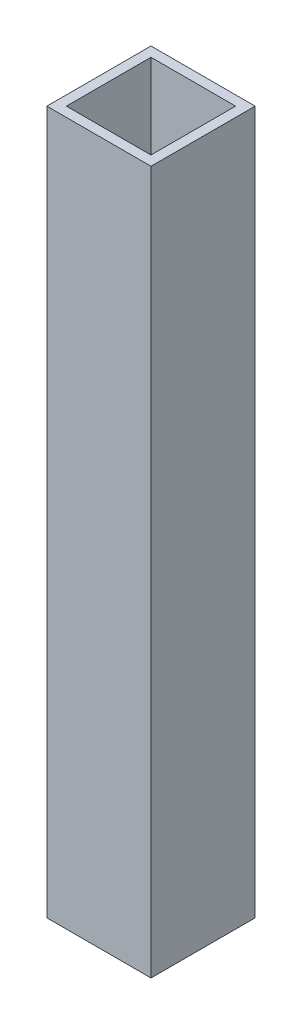
ISO-10303-21;
HEADER;
FILE_DESCRIPTION(('STEP AP214'),'2;1');
FILE_NAME('part.step','',(''),(''),'','','');
FILE_SCHEMA(('AUTOMOTIVE_DESIGN { 1 0 10303 214 1 1 1 1 }'));
ENDSEC;
DATA;
#1=APPLICATION_CONTEXT('core data for automotive mechanical design processes');
#2=APPLICATION_PROTOCOL_DEFINITION('international standard','automotive_design',2000,#1);
#3=PRODUCT_CONTEXT('',#1,'mechanical');
#4=PRODUCT('Part','Part','',(#3));
#5=PRODUCT_RELATED_PRODUCT_CATEGORY('part','',(#4));
#6=PRODUCT_DEFINITION_FORMATION('','',#4);
#7=PRODUCT_DEFINITION_CONTEXT('part definition',#1,'design');
#8=PRODUCT_DEFINITION('design','',#6,#7);
#9=PRODUCT_DEFINITION_SHAPE('','',#8);
#10=(LENGTH_UNIT() NAMED_UNIT(*) SI_UNIT(.MILLI.,.METRE.));
#11=(NAMED_UNIT(*) PLANE_ANGLE_UNIT() SI_UNIT($,.RADIAN.));
#12=(NAMED_UNIT(*) SI_UNIT($,.STERADIAN.) SOLID_ANGLE_UNIT());
#13=UNCERTAINTY_MEASURE_WITH_UNIT(LENGTH_MEASURE(1.E-05),#10,'distance_accuracy_value','');
#14=(GEOMETRIC_REPRESENTATION_CONTEXT(3) GLOBAL_UNCERTAINTY_ASSIGNED_CONTEXT((#13)) GLOBAL_UNIT_ASSIGNED_CONTEXT((#10,
#11,#12)) REPRESENTATION_CONTEXT('',''));
#15=CARTESIAN_POINT('',(0.,0.,0.));
#16=DIRECTION('',(0.,0.,1.));
#17=DIRECTION('',(1.,0.,0.));
#18=AXIS2_PLACEMENT_3D('',#15,#16,#17);
#19=CARTESIAN_POINT('',(25.4,171.45,50.8));
#20=DIRECTION('',(-1.,0.,0.));
#21=DIRECTION('',(0.,-1.,0.));
#22=AXIS2_PLACEMENT_3D('',#19,#20,#21);
#23=PLANE('',#22);
#24=DIRECTION('',(0.,1.,0.));
#25=VECTOR('',#24,1.);
#26=CARTESIAN_POINT('',(25.4,171.45,0.));
#27=LINE('',#26,#25);
#28=CARTESIAN_POINT('',(25.4,-171.45,0.));
#29=VERTEX_POINT('',#28);
#30=CARTESIAN_POINT('',(25.4,171.45,0.));
#31=VERTEX_POINT('',#30);
#32=EDGE_CURVE('E95',#29,#31,#27,.T.);
#33=ORIENTED_EDGE('',*,*,#32,.T.);
#34=DIRECTION('',(0.,0.,-1.));
#35=VECTOR('',#34,1.);
#36=CARTESIAN_POINT('',(25.4,171.45,50.8));
#37=LINE('',#36,#35);
#38=CARTESIAN_POINT('',(25.4,171.45,50.8));
#39=VERTEX_POINT('',#38);
#40=EDGE_CURVE('E11',#39,#31,#37,.T.);
#41=ORIENTED_EDGE('',*,*,#40,.F.);
#42=DIRECTION('',(0.,1.,0.));
#43=VECTOR('',#42,1.);
#44=CARTESIAN_POINT('',(25.4,171.45,50.8));
#45=LINE('',#44,#43);
#46=CARTESIAN_POINT('',(25.4,-171.45,50.8));
#47=VERTEX_POINT('',#46);
#48=EDGE_CURVE('E118',#47,#39,#45,.T.);
#49=ORIENTED_EDGE('',*,*,#48,.F.);
#50=DIRECTION('',(0.,0.,-1.));
#51=VECTOR('',#50,1.);
#52=CARTESIAN_POINT('',(25.4,-171.45,50.8));
#53=LINE('',#52,#51);
#54=EDGE_CURVE('E128',#47,#29,#53,.T.);
#55=ORIENTED_EDGE('',*,*,#54,.T.);
#56=EDGE_LOOP('',(#33,#41,#49,#55));
#57=FACE_BOUND('',#56,.T.);
#58=ADVANCED_FACE('F17',(#57),#23,.F.);
#59=CARTESIAN_POINT('',(-25.4,171.45,50.8));
#60=DIRECTION('',(0.,-1.,0.));
#61=DIRECTION('',(0.,0.,-1.));
#62=AXIS2_PLACEMENT_3D('',#59,#60,#61);
#63=PLANE('',#62);
#64=DIRECTION('',(0.,0.,-1.));
#65=VECTOR('',#64,1.);
#66=CARTESIAN_POINT('',(20.6375,171.45,46.0375));
#67=LINE('',#66,#65);
#68=CARTESIAN_POINT('',(20.6375,171.45,46.0375));
#69=VERTEX_POINT('',#68);
#70=CARTESIAN_POINT('',(20.6375,171.45,4.7625));
#71=VERTEX_POINT('',#70);
#72=EDGE_CURVE('E103',#69,#71,#67,.T.);
#73=ORIENTED_EDGE('',*,*,#72,.F.);
#74=DIRECTION('',(1.,0.,0.));
#75=VECTOR('',#74,1.);
#76=CARTESIAN_POINT('',(-20.6375,171.45,46.0375));
#77=LINE('',#76,#75);
#78=CARTESIAN_POINT('',(-20.6375,171.45,46.0375));
#79=VERTEX_POINT('',#78);
#80=EDGE_CURVE('E31',#79,#69,#77,.T.);
#81=ORIENTED_EDGE('',*,*,#80,.F.);
#82=DIRECTION('',(0.,0.,1.));
#83=VECTOR('',#82,1.);
#84=CARTESIAN_POINT('',(-20.6375,171.45,4.7625));
#85=LINE('',#84,#83);
#86=CARTESIAN_POINT('',(-20.6375,171.45,4.7625));
#87=VERTEX_POINT('',#86);
#88=EDGE_CURVE('E89',#87,#79,#85,.T.);
#89=ORIENTED_EDGE('',*,*,#88,.F.);
#90=DIRECTION('',(-1.,0.,0.));
#91=VECTOR('',#90,1.);
#92=CARTESIAN_POINT('',(20.6375,171.45,4.7625));
#93=LINE('',#92,#91);
#94=EDGE_CURVE('E109',#71,#87,#93,.T.);
#95=ORIENTED_EDGE('',*,*,#94,.F.);
#96=EDGE_LOOP('',(#73,#81,#89,#95));
#97=FACE_BOUND('',#96,.T.);
#98=DIRECTION('',(-1.,0.,0.));
#99=VECTOR('',#98,1.);
#100=CARTESIAN_POINT('',(-25.4,171.45,0.));
#101=LINE('',#100,#99);
#102=CARTESIAN_POINT('',(-25.4,171.45,0.));
#103=VERTEX_POINT('',#102);
#104=EDGE_CURVE('E131',#31,#103,#101,.T.);
#105=ORIENTED_EDGE('',*,*,#104,.T.);
#106=DIRECTION('',(0.,0.,-1.));
#107=VECTOR('',#106,1.);
#108=CARTESIAN_POINT('',(-25.4,171.45,50.8));
#109=LINE('',#108,#107);
#110=CARTESIAN_POINT('',(-25.4,171.45,50.8));
#111=VERTEX_POINT('',#110);
#112=EDGE_CURVE('E24',#111,#103,#109,.T.);
#113=ORIENTED_EDGE('',*,*,#112,.F.);
#114=DIRECTION('',(-1.,0.,0.));
#115=VECTOR('',#114,1.);
#116=CARTESIAN_POINT('',(-25.4,171.45,50.8));
#117=LINE('',#116,#115);
#118=EDGE_CURVE('E121',#39,#111,#117,.T.);
#119=ORIENTED_EDGE('',*,*,#118,.F.);
#120=ORIENTED_EDGE('',*,*,#40,.T.);
#121=EDGE_LOOP('',(#105,#113,#119,#120));
#122=FACE_BOUND('',#121,.T.);
#123=ADVANCED_FACE('F159',(#97,#122),#63,.F.);
#124=CARTESIAN_POINT('',(-25.4,171.45,50.8));
#125=DIRECTION('',(1.,0.,0.));
#126=DIRECTION('',(0.,1.,0.));
#127=AXIS2_PLACEMENT_3D('',#124,#125,#126);
#128=PLANE('',#127);
#129=DIRECTION('',(0.,-1.,0.));
#130=VECTOR('',#129,1.);
#131=CARTESIAN_POINT('',(-25.4,171.45,0.));
#132=LINE('',#131,#130);
#133=CARTESIAN_POINT('',(-25.4,-171.45,0.));
#134=VERTEX_POINT('',#133);
#135=EDGE_CURVE('E133',#103,#134,#132,.T.);
#136=ORIENTED_EDGE('',*,*,#135,.T.);
#137=DIRECTION('',(0.,0.,-1.));
#138=VECTOR('',#137,1.);
#139=CARTESIAN_POINT('',(-25.4,-171.45,50.8));
#140=LINE('',#139,#138);
#141=CARTESIAN_POINT('',(-25.4,-171.45,50.8));
#142=VERTEX_POINT('',#141);
#143=EDGE_CURVE('E138',#142,#134,#140,.T.);
#144=ORIENTED_EDGE('',*,*,#143,.F.);
#145=DIRECTION('',(0.,-1.,0.));
#146=VECTOR('',#145,1.);
#147=CARTESIAN_POINT('',(-25.4,171.45,50.8));
#148=LINE('',#147,#146);
#149=EDGE_CURVE('E124',#111,#142,#148,.T.);
#150=ORIENTED_EDGE('',*,*,#149,.F.);
#151=ORIENTED_EDGE('',*,*,#112,.T.);
#152=EDGE_LOOP('',(#136,#144,#150,#151));
#153=FACE_BOUND('',#152,.T.);
#154=ADVANCED_FACE('F145',(#153),#128,.F.);
#155=CARTESIAN_POINT('',(-25.4,-171.45,50.8));
#156=DIRECTION('',(0.,1.,0.));
#157=DIRECTION('',(0.,0.,1.));
#158=AXIS2_PLACEMENT_3D('',#155,#156,#157);
#159=PLANE('',#158);
#160=DIRECTION('',(0.,0.,-1.));
#161=VECTOR('',#160,1.);
#162=CARTESIAN_POINT('',(-20.6375,-171.45,4.7625));
#163=LINE('',#162,#161);
#164=CARTESIAN_POINT('',(-20.6375,-171.45,46.0375));
#165=VERTEX_POINT('',#164);
#166=CARTESIAN_POINT('',(-20.6375,-171.45,4.7625));
#167=VERTEX_POINT('',#166);
#168=EDGE_CURVE('E101',#165,#167,#163,.T.);
#169=ORIENTED_EDGE('',*,*,#168,.F.);
#170=DIRECTION('',(-1.,0.,0.));
#171=VECTOR('',#170,1.);
#172=CARTESIAN_POINT('',(-20.6375,-171.45,46.0375));
#173=LINE('',#172,#171);
#174=CARTESIAN_POINT('',(20.6375,-171.45,46.0375));
#175=VERTEX_POINT('',#174);
#176=EDGE_CURVE('E83',#175,#165,#173,.T.);
#177=ORIENTED_EDGE('',*,*,#176,.F.);
#178=DIRECTION('',(0.,0.,1.));
#179=VECTOR('',#178,1.);
#180=CARTESIAN_POINT('',(20.6375,-171.45,46.0375));
#181=LINE('',#180,#179);
#182=CARTESIAN_POINT('',(20.6375,-171.45,4.7625));
#183=VERTEX_POINT('',#182);
#184=EDGE_CURVE('E92',#183,#175,#181,.T.);
#185=ORIENTED_EDGE('',*,*,#184,.F.);
#186=DIRECTION('',(1.,0.,0.));
#187=VECTOR('',#186,1.);
#188=CARTESIAN_POINT('',(20.6375,-171.45,4.7625));
#189=LINE('',#188,#187);
#190=EDGE_CURVE('E39',#167,#183,#189,.T.);
#191=ORIENTED_EDGE('',*,*,#190,.F.);
#192=EDGE_LOOP('',(#169,#177,#185,#191));
#193=FACE_BOUND('',#192,.T.);
#194=DIRECTION('',(1.,0.,0.));
#195=VECTOR('',#194,1.);
#196=CARTESIAN_POINT('',(-25.4,-171.45,0.));
#197=LINE('',#196,#195);
#198=EDGE_CURVE('E122',#134,#29,#197,.T.);
#199=ORIENTED_EDGE('',*,*,#198,.T.);
#200=ORIENTED_EDGE('',*,*,#54,.F.);
#201=DIRECTION('',(1.,0.,0.));
#202=VECTOR('',#201,1.);
#203=CARTESIAN_POINT('',(-25.4,-171.45,50.8));
#204=LINE('',#203,#202);
#205=EDGE_CURVE('E126',#142,#47,#204,.T.);
#206=ORIENTED_EDGE('',*,*,#205,.F.);
#207=ORIENTED_EDGE('',*,*,#143,.T.);
#208=EDGE_LOOP('',(#199,#200,#206,#207));
#209=FACE_BOUND('',#208,.T.);
#210=ADVANCED_FACE('F98',(#193,#209),#159,.F.);
#211=CARTESIAN_POINT('',(25.4,-171.45,50.8));
#212=DIRECTION('',(0.,0.,1.));
#213=DIRECTION('',(1.,0.,0.));
#214=AXIS2_PLACEMENT_3D('',#211,#212,#213);
#215=PLANE('',#214);
#216=ORIENTED_EDGE('',*,*,#48,.T.);
#217=ORIENTED_EDGE('',*,*,#118,.T.);
#218=ORIENTED_EDGE('',*,*,#149,.T.);
#219=ORIENTED_EDGE('',*,*,#205,.T.);
#220=EDGE_LOOP('',(#216,#217,#218,#219));
#221=FACE_BOUND('',#220,.T.);
#222=ADVANCED_FACE('F158',(#221),#215,.T.);
#223=CARTESIAN_POINT('',(25.4,-171.45,0.));
#224=DIRECTION('',(0.,0.,1.));
#225=DIRECTION('',(1.,0.,0.));
#226=AXIS2_PLACEMENT_3D('',#223,#224,#225);
#227=PLANE('',#226);
#228=ORIENTED_EDGE('',*,*,#32,.F.);
#229=ORIENTED_EDGE('',*,*,#198,.F.);
#230=ORIENTED_EDGE('',*,*,#135,.F.);
#231=ORIENTED_EDGE('',*,*,#104,.F.);
#232=EDGE_LOOP('',(#228,#229,#230,#231));
#233=FACE_BOUND('',#232,.T.);
#234=ADVANCED_FACE('F151',(#233),#227,.F.);
#235=CARTESIAN_POINT('',(-20.6375,-171.451,46.0375));
#236=DIRECTION('',(0.,0.,1.));
#237=DIRECTION('',(1.,0.,0.));
#238=AXIS2_PLACEMENT_3D('',#235,#236,#237);
#239=PLANE('',#238);
#240=ORIENTED_EDGE('',*,*,#176,.T.);
#241=DIRECTION('',(0.,1.,0.));
#242=VECTOR('',#241,1.);
#243=CARTESIAN_POINT('',(-20.6375,-171.451,46.0375));
#244=LINE('',#243,#242);
#245=EDGE_CURVE('E96',#165,#79,#244,.T.);
#246=ORIENTED_EDGE('',*,*,#245,.T.);
#247=ORIENTED_EDGE('',*,*,#80,.T.);
#248=DIRECTION('',(0.,1.,0.));
#249=VECTOR('',#248,1.);
#250=CARTESIAN_POINT('',(20.6375,-171.451,46.0375));
#251=LINE('',#250,#249);
#252=EDGE_CURVE('E79',#175,#69,#251,.T.);
#253=ORIENTED_EDGE('',*,*,#252,.F.);
#254=EDGE_LOOP('',(#240,#246,#247,#253));
#255=FACE_BOUND('',#254,.T.);
#256=ADVANCED_FACE('F81',(#255),#239,.F.);
#257=CARTESIAN_POINT('',(-20.6375,-171.451,4.7625));
#258=DIRECTION('',(-1.,0.,0.));
#259=DIRECTION('',(0.,0.,1.));
#260=AXIS2_PLACEMENT_3D('',#257,#258,#259);
#261=PLANE('',#260);
#262=ORIENTED_EDGE('',*,*,#168,.T.);
#263=DIRECTION('',(0.,1.,0.));
#264=VECTOR('',#263,1.);
#265=CARTESIAN_POINT('',(-20.6375,-171.451,4.7625));
#266=LINE('',#265,#264);
#267=EDGE_CURVE('E115',#167,#87,#266,.T.);
#268=ORIENTED_EDGE('',*,*,#267,.T.);
#269=ORIENTED_EDGE('',*,*,#88,.T.);
#270=ORIENTED_EDGE('',*,*,#245,.F.);
#271=EDGE_LOOP('',(#262,#268,#269,#270));
#272=FACE_BOUND('',#271,.T.);
#273=ADVANCED_FACE('F178',(#272),#261,.F.);
#274=CARTESIAN_POINT('',(20.6375,-171.451,4.7625));
#275=DIRECTION('',(0.,0.,-1.));
#276=DIRECTION('',(-1.,0.,0.));
#277=AXIS2_PLACEMENT_3D('',#274,#275,#276);
#278=PLANE('',#277);
#279=ORIENTED_EDGE('',*,*,#190,.T.);
#280=DIRECTION('',(0.,1.,0.));
#281=VECTOR('',#280,1.);
#282=CARTESIAN_POINT('',(20.6375,-171.451,4.7625));
#283=LINE('',#282,#281);
#284=EDGE_CURVE('E88',#183,#71,#283,.T.);
#285=ORIENTED_EDGE('',*,*,#284,.T.);
#286=ORIENTED_EDGE('',*,*,#94,.T.);
#287=ORIENTED_EDGE('',*,*,#267,.F.);
#288=EDGE_LOOP('',(#279,#285,#286,#287));
#289=FACE_BOUND('',#288,.T.);
#290=ADVANCED_FACE('F181',(#289),#278,.F.);
#291=CARTESIAN_POINT('',(20.6375,-171.451,46.0375));
#292=DIRECTION('',(1.,0.,0.));
#293=DIRECTION('',(0.,0.,-1.));
#294=AXIS2_PLACEMENT_3D('',#291,#292,#293);
#295=PLANE('',#294);
#296=ORIENTED_EDGE('',*,*,#184,.T.);
#297=ORIENTED_EDGE('',*,*,#252,.T.);
#298=ORIENTED_EDGE('',*,*,#72,.T.);
#299=ORIENTED_EDGE('',*,*,#284,.F.);
#300=EDGE_LOOP('',(#296,#297,#298,#299));
#301=FACE_BOUND('',#300,.T.);
#302=ADVANCED_FACE('F93',(#301),#295,.F.);
#303=CLOSED_SHELL('',(#58,#123,#154,#210,#222,#234,#256,#273,#290,#302));
#304=MANIFOLD_SOLID_BREP('B1',#303);
#305=ADVANCED_BREP_SHAPE_REPRESENTATION('',(#18,#304),#14);
#306=SHAPE_DEFINITION_REPRESENTATION(#9,#305);
ENDSEC;
END-ISO-10303-21;
